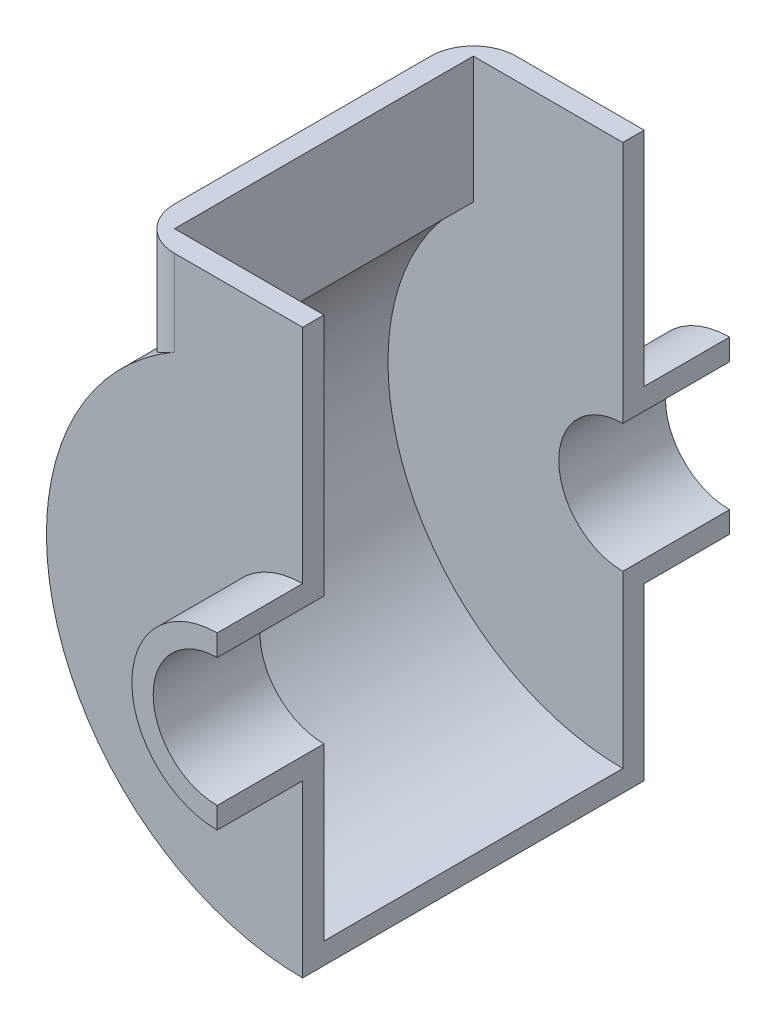
ISO-10303-21;
HEADER;
FILE_DESCRIPTION(('STEP AP214'),'2;1');
FILE_NAME('part.step','',(''),(''),'','','');
FILE_SCHEMA(('AUTOMOTIVE_DESIGN { 1 0 10303 214 1 1 1 1 }'));
ENDSEC;
DATA;
#1=APPLICATION_CONTEXT('core data for automotive mechanical design processes');
#2=APPLICATION_PROTOCOL_DEFINITION('international standard','automotive_design',2000,#1);
#3=PRODUCT_CONTEXT('',#1,'mechanical');
#4=PRODUCT('Part','Part','',(#3));
#5=PRODUCT_RELATED_PRODUCT_CATEGORY('part','',(#4));
#6=PRODUCT_DEFINITION_FORMATION('','',#4);
#7=PRODUCT_DEFINITION_CONTEXT('part definition',#1,'design');
#8=PRODUCT_DEFINITION('design','',#6,#7);
#9=PRODUCT_DEFINITION_SHAPE('','',#8);
#10=(LENGTH_UNIT() NAMED_UNIT(*) SI_UNIT(.MILLI.,.METRE.));
#11=(NAMED_UNIT(*) PLANE_ANGLE_UNIT() SI_UNIT($,.RADIAN.));
#12=(NAMED_UNIT(*) SI_UNIT($,.STERADIAN.) SOLID_ANGLE_UNIT());
#13=UNCERTAINTY_MEASURE_WITH_UNIT(LENGTH_MEASURE(1.E-05),#10,'distance_accuracy_value','');
#14=(GEOMETRIC_REPRESENTATION_CONTEXT(3) GLOBAL_UNCERTAINTY_ASSIGNED_CONTEXT((#13)) GLOBAL_UNIT_ASSIGNED_CONTEXT((#10,
#11,#12)) REPRESENTATION_CONTEXT('',''));
#15=CARTESIAN_POINT('',(0.,0.,0.));
#16=DIRECTION('',(0.,0.,1.));
#17=DIRECTION('',(1.,0.,0.));
#18=AXIS2_PLACEMENT_3D('',#15,#16,#17);
#19=CARTESIAN_POINT('',(0.,0.,0.));
#20=DIRECTION('',(0.,0.,1.));
#21=DIRECTION('',(1.,0.,0.));
#22=AXIS2_PLACEMENT_3D('',#19,#20,#21);
#23=PLANE('',#22);
#24=CARTESIAN_POINT('',(0.,0.,0.));
#25=DIRECTION('',(0.,0.,1.));
#26=DIRECTION('',(1.,0.,0.));
#27=AXIS2_PLACEMENT_3D('',#24,#25,#26);
#28=CIRCLE('',#27,55.);
#29=CARTESIAN_POINT('',(-35.,42.4264068711928,0.));
#30=VERTEX_POINT('',#29);
#31=CARTESIAN_POINT('',(0.,-55.,0.));
#32=VERTEX_POINT('',#31);
#33=EDGE_CURVE('E227',#30,#32,#28,.T.);
#34=ORIENTED_EDGE('',*,*,#33,.F.);
#35=DIRECTION('',(0.,1.,0.));
#36=VECTOR('',#35,1.);
#37=CARTESIAN_POINT('',(-35.,72.,0.));
#38=LINE('',#37,#36);
#39=CARTESIAN_POINT('',(-35.,72.,0.));
#40=VERTEX_POINT('',#39);
#41=EDGE_CURVE('E231',#40,#30,#38,.F.);
#42=ORIENTED_EDGE('',*,*,#41,.F.);
#43=DIRECTION('',(-1.,0.,0.));
#44=VECTOR('',#43,1.);
#45=CARTESIAN_POINT('',(-40.,72.,0.));
#46=LINE('',#45,#44);
#47=CARTESIAN_POINT('',(0.,72.,0.));
#48=VERTEX_POINT('',#47);
#49=EDGE_CURVE('E230',#48,#40,#46,.T.);
#50=ORIENTED_EDGE('',*,*,#49,.F.);
#51=DIRECTION('',(0.,1.,0.));
#52=VECTOR('',#51,1.);
#53=CARTESIAN_POINT('',(0.,15.,0.));
#54=LINE('',#53,#52);
#55=CARTESIAN_POINT('',(0.,15.,0.));
#56=VERTEX_POINT('',#55);
#57=EDGE_CURVE('E287',#56,#48,#54,.T.);
#58=ORIENTED_EDGE('',*,*,#57,.F.);
#59=CARTESIAN_POINT('',(0.,0.,0.));
#60=DIRECTION('',(0.,0.,-1.));
#61=DIRECTION('',(1.,0.,0.));
#62=AXIS2_PLACEMENT_3D('',#59,#60,#61);
#63=CIRCLE('',#62,15.);
#64=CARTESIAN_POINT('',(0.,-15.,0.));
#65=VERTEX_POINT('',#64);
#66=EDGE_CURVE('E273',#65,#56,#63,.T.);
#67=ORIENTED_EDGE('',*,*,#66,.F.);
#68=DIRECTION('',(0.,1.,0.));
#69=VECTOR('',#68,1.);
#70=CARTESIAN_POINT('',(0.,-15.,0.));
#71=LINE('',#70,#69);
#72=EDGE_CURVE('E278',#32,#65,#71,.T.);
#73=ORIENTED_EDGE('',*,*,#72,.F.);
#74=EDGE_LOOP('',(#34,#42,#50,#58,#67,#73));
#75=FACE_BOUND('',#74,.T.);
#76=ADVANCED_FACE('F39',(#75),#23,.F.);
#77=CARTESIAN_POINT('',(0.,0.,25.));
#78=DIRECTION('',(0.,0.,-1.));
#79=DIRECTION('',(-1.,0.,0.));
#80=AXIS2_PLACEMENT_3D('',#77,#78,#79);
#81=CYLINDRICAL_SURFACE('',#80,15.);
#82=DIRECTION('',(0.,0.,-1.));
#83=VECTOR('',#82,1.);
#84=CARTESIAN_POINT('',(0.,-15.,25.));
#85=LINE('',#84,#83);
#86=CARTESIAN_POINT('',(0.,-15.,25.));
#87=VERTEX_POINT('',#86);
#88=EDGE_CURVE('E284',#87,#65,#85,.T.);
#89=ORIENTED_EDGE('',*,*,#88,.T.);
#90=ORIENTED_EDGE('',*,*,#66,.T.);
#91=DIRECTION('',(0.,0.,-1.));
#92=VECTOR('',#91,1.);
#93=CARTESIAN_POINT('',(0.,15.,25.));
#94=LINE('',#93,#92);
#95=CARTESIAN_POINT('',(0.,15.,25.));
#96=VERTEX_POINT('',#95);
#97=EDGE_CURVE('E297',#96,#56,#94,.T.);
#98=ORIENTED_EDGE('',*,*,#97,.F.);
#99=CARTESIAN_POINT('',(0.,0.,25.));
#100=DIRECTION('',(0.,0.,-1.));
#101=DIRECTION('',(1.,0.,0.));
#102=AXIS2_PLACEMENT_3D('',#99,#100,#101);
#103=CIRCLE('',#102,15.);
#104=EDGE_CURVE('E274',#87,#96,#103,.T.);
#105=ORIENTED_EDGE('',*,*,#104,.F.);
#106=EDGE_LOOP('',(#89,#90,#98,#105));
#107=FACE_BOUND('',#106,.T.);
#108=ADVANCED_FACE('F323',(#107),#81,.F.);
#109=CARTESIAN_POINT('',(0.,15.,25.));
#110=DIRECTION('',(-1.,0.,0.));
#111=DIRECTION('',(0.,-1.,0.));
#112=AXIS2_PLACEMENT_3D('',#109,#110,#111);
#113=PLANE('',#112);
#114=ORIENTED_EDGE('',*,*,#97,.T.);
#115=ORIENTED_EDGE('',*,*,#57,.T.);
#116=DIRECTION('',(0.,0.,-1.));
#117=VECTOR('',#116,1.);
#118=CARTESIAN_POINT('',(0.,72.,5.));
#119=LINE('',#118,#117);
#120=CARTESIAN_POINT('',(0.,72.,5.));
#121=VERTEX_POINT('',#120);
#122=EDGE_CURVE('E268',#121,#48,#119,.T.);
#123=ORIENTED_EDGE('',*,*,#122,.F.);
#124=DIRECTION('',(0.,1.,0.));
#125=VECTOR('',#124,1.);
#126=CARTESIAN_POINT('',(0.,15.,5.));
#127=LINE('',#126,#125);
#128=CARTESIAN_POINT('',(0.,20.,5.));
#129=VERTEX_POINT('',#128);
#130=EDGE_CURVE('E248',#129,#121,#127,.T.);
#131=ORIENTED_EDGE('',*,*,#130,.F.);
#132=DIRECTION('',(0.,0.,-1.));
#133=VECTOR('',#132,1.);
#134=CARTESIAN_POINT('',(0.,20.,25.));
#135=LINE('',#134,#133);
#136=CARTESIAN_POINT('',(0.,20.,25.));
#137=VERTEX_POINT('',#136);
#138=EDGE_CURVE('E295',#137,#129,#135,.T.);
#139=ORIENTED_EDGE('',*,*,#138,.F.);
#140=DIRECTION('',(0.,1.,0.));
#141=VECTOR('',#140,1.);
#142=CARTESIAN_POINT('',(0.,15.,25.));
#143=LINE('',#142,#141);
#144=EDGE_CURVE('E277',#96,#137,#143,.T.);
#145=ORIENTED_EDGE('',*,*,#144,.F.);
#146=EDGE_LOOP('',(#114,#115,#123,#131,#139,#145));
#147=FACE_BOUND('',#146,.T.);
#148=ADVANCED_FACE('F326',(#147),#113,.F.);
#149=CARTESIAN_POINT('',(0.,0.,25.));
#150=DIRECTION('',(0.,0.,-1.));
#151=DIRECTION('',(-1.,0.,0.));
#152=AXIS2_PLACEMENT_3D('',#149,#150,#151);
#153=CYLINDRICAL_SURFACE('',#152,20.);
#154=ORIENTED_EDGE('',*,*,#138,.T.);
#155=CARTESIAN_POINT('',(0.,0.,5.));
#156=DIRECTION('',(0.,0.,1.));
#157=DIRECTION('',(1.,0.,0.));
#158=AXIS2_PLACEMENT_3D('',#155,#156,#157);
#159=CIRCLE('',#158,20.);
#160=CARTESIAN_POINT('',(0.,-20.,5.));
#161=VERTEX_POINT('',#160);
#162=EDGE_CURVE('E271',#129,#161,#159,.T.);
#163=ORIENTED_EDGE('',*,*,#162,.T.);
#164=DIRECTION('',(0.,0.,-1.));
#165=VECTOR('',#164,1.);
#166=CARTESIAN_POINT('',(0.,-20.,25.));
#167=LINE('',#166,#165);
#168=CARTESIAN_POINT('',(0.,-20.,25.));
#169=VERTEX_POINT('',#168);
#170=EDGE_CURVE('E292',#169,#161,#167,.T.);
#171=ORIENTED_EDGE('',*,*,#170,.F.);
#172=CARTESIAN_POINT('',(0.,0.,25.));
#173=DIRECTION('',(0.,0.,1.));
#174=DIRECTION('',(1.,0.,0.));
#175=AXIS2_PLACEMENT_3D('',#172,#173,#174);
#176=CIRCLE('',#175,20.);
#177=EDGE_CURVE('E280',#137,#169,#176,.T.);
#178=ORIENTED_EDGE('',*,*,#177,.F.);
#179=EDGE_LOOP('',(#154,#163,#171,#178));
#180=FACE_BOUND('',#179,.T.);
#181=ADVANCED_FACE('F330',(#180),#153,.T.);
#182=CARTESIAN_POINT('',(0.,-15.,25.));
#183=DIRECTION('',(-1.,0.,0.));
#184=DIRECTION('',(0.,-1.,0.));
#185=AXIS2_PLACEMENT_3D('',#182,#183,#184);
#186=PLANE('',#185);
#187=ORIENTED_EDGE('',*,*,#170,.T.);
#188=DIRECTION('',(0.,1.,0.));
#189=VECTOR('',#188,1.);
#190=CARTESIAN_POINT('',(0.,-20.,5.));
#191=LINE('',#190,#189);
#192=CARTESIAN_POINT('',(0.,-60.,5.));
#193=VERTEX_POINT('',#192);
#194=EDGE_CURVE('E255',#193,#161,#191,.T.);
#195=ORIENTED_EDGE('',*,*,#194,.F.);
#196=DIRECTION('',(0.,0.,-1.));
#197=VECTOR('',#196,1.);
#198=CARTESIAN_POINT('',(0.,-60.,5.));
#199=LINE('',#198,#197);
#200=CARTESIAN_POINT('',(0.,-60.,-75.));
#201=VERTEX_POINT('',#200);
#202=EDGE_CURVE('E258',#193,#201,#199,.T.);
#203=ORIENTED_EDGE('',*,*,#202,.T.);
#204=DIRECTION('',(0.,1.,0.));
#205=VECTOR('',#204,1.);
#206=CARTESIAN_POINT('',(0.,-20.,-75.));
#207=LINE('',#206,#205);
#208=CARTESIAN_POINT('',(0.,-20.,-75.));
#209=VERTEX_POINT('',#208);
#210=EDGE_CURVE('E186',#201,#209,#207,.T.);
#211=ORIENTED_EDGE('',*,*,#210,.T.);
#212=DIRECTION('',(0.,0.,1.));
#213=VECTOR('',#212,1.);
#214=CARTESIAN_POINT('',(0.,-20.,-95.));
#215=LINE('',#214,#213);
#216=CARTESIAN_POINT('',(0.,-20.,-95.));
#217=VERTEX_POINT('',#216);
#218=EDGE_CURVE('E219',#217,#209,#215,.T.);
#219=ORIENTED_EDGE('',*,*,#218,.F.);
#220=DIRECTION('',(0.,1.,0.));
#221=VECTOR('',#220,1.);
#222=CARTESIAN_POINT('',(0.,-15.,-95.));
#223=LINE('',#222,#221);
#224=CARTESIAN_POINT('',(0.,-15.,-95.));
#225=VERTEX_POINT('',#224);
#226=EDGE_CURVE('E209',#217,#225,#223,.T.);
#227=ORIENTED_EDGE('',*,*,#226,.T.);
#228=DIRECTION('',(0.,0.,1.));
#229=VECTOR('',#228,1.);
#230=CARTESIAN_POINT('',(0.,-15.,-95.));
#231=LINE('',#230,#229);
#232=CARTESIAN_POINT('',(0.,-15.,-70.));
#233=VERTEX_POINT('',#232);
#234=EDGE_CURVE('E211',#225,#233,#231,.T.);
#235=ORIENTED_EDGE('',*,*,#234,.T.);
#236=DIRECTION('',(0.,1.,0.));
#237=VECTOR('',#236,1.);
#238=CARTESIAN_POINT('',(0.,-15.,-70.));
#239=LINE('',#238,#237);
#240=CARTESIAN_POINT('',(0.,-55.,-70.));
#241=VERTEX_POINT('',#240);
#242=EDGE_CURVE('E204',#241,#233,#239,.T.);
#243=ORIENTED_EDGE('',*,*,#242,.F.);
#244=DIRECTION('',(0.,0.,1.));
#245=VECTOR('',#244,1.);
#246=CARTESIAN_POINT('',(0.,-55.,-95.002));
#247=LINE('',#246,#245);
#248=EDGE_CURVE('E235',#241,#32,#247,.T.);
#249=ORIENTED_EDGE('',*,*,#248,.T.);
#250=ORIENTED_EDGE('',*,*,#72,.T.);
#251=ORIENTED_EDGE('',*,*,#88,.F.);
#252=DIRECTION('',(0.,1.,0.));
#253=VECTOR('',#252,1.);
#254=CARTESIAN_POINT('',(0.,-15.,25.));
#255=LINE('',#254,#253);
#256=EDGE_CURVE('E282',#169,#87,#255,.T.);
#257=ORIENTED_EDGE('',*,*,#256,.F.);
#258=EDGE_LOOP('',(#187,#195,#203,#211,#219,#227,#235,#243,#249,#250,#251,#257));
#259=FACE_BOUND('',#258,.T.);
#260=ADVANCED_FACE('F334',(#259),#186,.F.);
#261=CARTESIAN_POINT('',(0.,0.,25.));
#262=DIRECTION('',(0.,0.,1.));
#263=DIRECTION('',(1.,0.,0.));
#264=AXIS2_PLACEMENT_3D('',#261,#262,#263);
#265=PLANE('',#264);
#266=ORIENTED_EDGE('',*,*,#104,.T.);
#267=ORIENTED_EDGE('',*,*,#144,.T.);
#268=ORIENTED_EDGE('',*,*,#177,.T.);
#269=ORIENTED_EDGE('',*,*,#256,.T.);
#270=EDGE_LOOP('',(#266,#267,#268,#269));
#271=FACE_BOUND('',#270,.T.);
#272=ADVANCED_FACE('F338',(#271),#265,.T.);
#273=CARTESIAN_POINT('',(0.,0.,5.));
#274=DIRECTION('',(0.,0.,1.));
#275=DIRECTION('',(1.,0.,0.));
#276=AXIS2_PLACEMENT_3D('',#273,#274,#275);
#277=PLANE('',#276);
#278=DIRECTION('',(-1.,0.,0.));
#279=VECTOR('',#278,1.);
#280=CARTESIAN_POINT('',(-40.,72.,5.));
#281=LINE('',#280,#279);
#282=CARTESIAN_POINT('',(-30.,72.,5.));
#283=VERTEX_POINT('',#282);
#284=EDGE_CURVE('E250',#121,#283,#281,.T.);
#285=ORIENTED_EDGE('',*,*,#284,.T.);
#286=DIRECTION('',(0.,-1.,0.));
#287=VECTOR('',#286,1.);
#288=CARTESIAN_POINT('',(-30.,44.7213595499958,5.));
#289=LINE('',#288,#287);
#290=CARTESIAN_POINT('',(-30.,51.9615242270663,5.));
#291=VERTEX_POINT('',#290);
#292=EDGE_CURVE('E299',#283,#291,#289,.T.);
#293=ORIENTED_EDGE('',*,*,#292,.T.);
#294=CARTESIAN_POINT('',(0.,0.,5.));
#295=DIRECTION('',(0.,0.,1.));
#296=DIRECTION('',(1.,0.,0.));
#297=AXIS2_PLACEMENT_3D('',#294,#295,#296);
#298=CIRCLE('',#297,60.);
#299=EDGE_CURVE('E253',#291,#193,#298,.T.);
#300=ORIENTED_EDGE('',*,*,#299,.T.);
#301=ORIENTED_EDGE('',*,*,#194,.T.);
#302=ORIENTED_EDGE('',*,*,#162,.F.);
#303=ORIENTED_EDGE('',*,*,#130,.T.);
#304=EDGE_LOOP('',(#285,#293,#300,#301,#302,#303));
#305=FACE_BOUND('',#304,.T.);
#306=ADVANCED_FACE('F345',(#305),#277,.T.);
#307=CARTESIAN_POINT('',(-40.,72.,5.));
#308=DIRECTION('',(0.,-1.,0.));
#309=DIRECTION('',(0.,0.,-1.));
#310=AXIS2_PLACEMENT_3D('',#307,#308,#309);
#311=PLANE('',#310);
#312=DIRECTION('',(-1.,0.,0.));
#313=VECTOR('',#312,1.);
#314=CARTESIAN_POINT('',(-40.,72.,-75.));
#315=LINE('',#314,#313);
#316=CARTESIAN_POINT('',(0.,72.,-75.));
#317=VERTEX_POINT('',#316);
#318=CARTESIAN_POINT('',(-30.,72.,-75.));
#319=VERTEX_POINT('',#318);
#320=EDGE_CURVE('E167',#317,#319,#315,.T.);
#321=ORIENTED_EDGE('',*,*,#320,.T.);
#322=CARTESIAN_POINT('',(-30.,72.,-65.));
#323=DIRECTION('',(0.,-1.,0.));
#324=DIRECTION('',(0.,0.,-1.));
#325=AXIS2_PLACEMENT_3D('',#322,#323,#324);
#326=CIRCLE('',#325,10.);
#327=CARTESIAN_POINT('',(-40.,72.,-65.));
#328=VERTEX_POINT('',#327);
#329=EDGE_CURVE('E53',#319,#328,#326,.F.);
#330=ORIENTED_EDGE('',*,*,#329,.T.);
#331=DIRECTION('',(0.,0.,-1.));
#332=VECTOR('',#331,1.);
#333=CARTESIAN_POINT('',(-40.,72.,5.));
#334=LINE('',#333,#332);
#335=CARTESIAN_POINT('',(-40.,72.,-5.));
#336=VERTEX_POINT('',#335);
#337=EDGE_CURVE('E265',#336,#328,#334,.T.);
#338=ORIENTED_EDGE('',*,*,#337,.F.);
#339=CARTESIAN_POINT('',(-30.,72.,-5.));
#340=DIRECTION('',(0.,-1.,0.));
#341=DIRECTION('',(0.,0.,-1.));
#342=AXIS2_PLACEMENT_3D('',#339,#340,#341);
#343=CIRCLE('',#342,10.);
#344=EDGE_CURVE('E304',#336,#283,#343,.F.);
#345=ORIENTED_EDGE('',*,*,#344,.T.);
#346=ORIENTED_EDGE('',*,*,#284,.F.);
#347=ORIENTED_EDGE('',*,*,#122,.T.);
#348=ORIENTED_EDGE('',*,*,#49,.T.);
#349=DIRECTION('',(0.,0.,1.));
#350=VECTOR('',#349,1.);
#351=CARTESIAN_POINT('',(-35.,72.,-95.002));
#352=LINE('',#351,#350);
#353=CARTESIAN_POINT('',(-35.,72.,-70.));
#354=VERTEX_POINT('',#353);
#355=EDGE_CURVE('E234',#354,#40,#352,.T.);
#356=ORIENTED_EDGE('',*,*,#355,.F.);
#357=DIRECTION('',(-1.,0.,0.));
#358=VECTOR('',#357,1.);
#359=CARTESIAN_POINT('',(-40.,72.,-70.));
#360=LINE('',#359,#358);
#361=CARTESIAN_POINT('',(0.,72.,-70.));
#362=VERTEX_POINT('',#361);
#363=EDGE_CURVE('E182',#362,#354,#360,.T.);
#364=ORIENTED_EDGE('',*,*,#363,.F.);
#365=DIRECTION('',(0.,0.,1.));
#366=VECTOR('',#365,1.);
#367=CARTESIAN_POINT('',(0.,72.,-75.));
#368=LINE('',#367,#366);
#369=EDGE_CURVE('E178',#317,#362,#368,.T.);
#370=ORIENTED_EDGE('',*,*,#369,.F.);
#371=EDGE_LOOP('',(#321,#330,#338,#345,#346,#347,#348,#356,#364,#370));
#372=FACE_BOUND('',#371,.T.);
#373=ADVANCED_FACE('F179',(#372),#311,.F.);
#374=CARTESIAN_POINT('',(-40.,44.7213595499958,5.));
#375=DIRECTION('',(1.,0.,0.));
#376=DIRECTION('',(0.,0.,-1.));
#377=AXIS2_PLACEMENT_3D('',#374,#375,#376);
#378=PLANE('',#377);
#379=ORIENTED_EDGE('',*,*,#337,.T.);
#380=DIRECTION('',(0.,-1.,0.));
#381=VECTOR('',#380,1.);
#382=CARTESIAN_POINT('',(-40.,44.7213595499958,-65.));
#383=LINE('',#382,#381);
#384=CARTESIAN_POINT('',(-40.,44.7213595499958,-65.));
#385=VERTEX_POINT('',#384);
#386=EDGE_CURVE('E312',#328,#385,#383,.T.);
#387=ORIENTED_EDGE('',*,*,#386,.T.);
#388=DIRECTION('',(0.,0.,-1.));
#389=VECTOR('',#388,1.);
#390=CARTESIAN_POINT('',(-40.,44.7213595499958,5.));
#391=LINE('',#390,#389);
#392=CARTESIAN_POINT('',(-40.,44.7213595499958,-5.));
#393=VERTEX_POINT('',#392);
#394=EDGE_CURVE('E262',#393,#385,#391,.T.);
#395=ORIENTED_EDGE('',*,*,#394,.F.);
#396=DIRECTION('',(0.,-1.,0.));
#397=VECTOR('',#396,1.);
#398=CARTESIAN_POINT('',(-40.,72.,-5.));
#399=LINE('',#398,#397);
#400=EDGE_CURVE('E302',#393,#336,#399,.F.);
#401=ORIENTED_EDGE('',*,*,#400,.T.);
#402=EDGE_LOOP('',(#379,#387,#395,#401));
#403=FACE_BOUND('',#402,.T.);
#404=ADVANCED_FACE('F348',(#403),#378,.F.);
#405=CARTESIAN_POINT('',(0.,0.,5.));
#406=DIRECTION('',(0.,0.,-1.));
#407=DIRECTION('',(-1.,0.,0.));
#408=AXIS2_PLACEMENT_3D('',#405,#406,#407);
#409=CYLINDRICAL_SURFACE('',#408,60.);
#410=ORIENTED_EDGE('',*,*,#299,.F.);
#411=CARTESIAN_POINT('',(-30.,51.9615242270663,5.));
#412=CARTESIAN_POINT('',(-30.1846403402756,51.8549243575684,4.99999694467445));
#413=CARTESIAN_POINT('',(-30.3686755821332,51.7473565843307,4.99488587812623));
#414=CARTESIAN_POINT('',(-30.7351668388072,51.5305231450817,4.97462918627216));
#415=CARTESIAN_POINT('',(-30.9176229894396,51.4212576273974,4.95948443281986));
#416=CARTESIAN_POINT('',(-31.4619253243051,51.0913595980358,4.89929167200636));
#417=CARTESIAN_POINT('',(-31.8209014856786,50.868512343648,4.83948477245505));
#418=CARTESIAN_POINT('',(-32.5288887310146,50.418725257113,4.68176841927459));
#419=CARTESIAN_POINT('',(-32.8778736192083,50.1917768316845,4.5837671788936));
#420=CARTESIAN_POINT('',(-33.562476910193,49.7365966241752,4.35090696893926));
#421=CARTESIAN_POINT('',(-33.8980954977704,49.5083648598862,4.21604850911225));
#422=CARTESIAN_POINT('',(-34.5207296024579,49.0759439346811,3.92574534472068));
#423=CARTESIAN_POINT('',(-34.8092512536601,48.8716304811259,3.77370267176126));
#424=CARTESIAN_POINT('',(-35.3716903107987,48.4661085573826,3.44107089228342));
#425=CARTESIAN_POINT('',(-35.6456079007732,48.2649000480893,3.26048214561176));
#426=CARTESIAN_POINT('',(-36.1765727574088,47.8682074936152,2.87135112309205));
#427=CARTESIAN_POINT('',(-36.4336405194033,47.6727166603459,2.66284378257167));
#428=CARTESIAN_POINT('',(-36.9290721152615,47.289972828363,2.21794621899144));
#429=CARTESIAN_POINT('',(-37.167441451851,47.1027174132443,1.98156425075618));
#430=CARTESIAN_POINT('',(-37.565018182153,46.785859634165,1.54478146403292));
#431=CARTESIAN_POINT('',(-37.7289458526818,46.6537017113221,1.35050833176437));
#432=CARTESIAN_POINT('',(-38.0437650386959,46.397339573439,0.946710505836691));
#433=CARTESIAN_POINT('',(-38.1946575996422,46.2731347207424,0.737187037795451));
#434=CARTESIAN_POINT('',(-38.4818360085844,46.0345861261904,0.303399948510743));
#435=CARTESIAN_POINT('',(-38.618136880254,45.9202322658759,0.0791518792914404));
#436=CARTESIAN_POINT('',(-38.8746918035924,45.7032445431668,-0.383743447816962));
#437=CARTESIAN_POINT('',(-38.9949492411763,45.6006082084878,-0.62238765196006));
#438=CARTESIAN_POINT('',(-39.1965662504922,45.4273417305266,-1.06669402634214));
#439=CARTESIAN_POINT('',(-39.2809795718102,45.3543309967536,-1.27004581930021));
#440=CARTESIAN_POINT('',(-39.437114382813,45.2186323209963,-1.68488791321454));
#441=CARTESIAN_POINT('',(-39.508838494378,45.1559422467147,-1.89637652189831));
#442=CARTESIAN_POINT('',(-39.6385128100447,45.0421551914612,-2.32617263610176));
#443=CARTESIAN_POINT('',(-39.6964869139818,44.9910381018204,-2.54446755239788));
#444=CARTESIAN_POINT('',(-39.7978943535571,44.9013606141582,-2.98685266600599));
#445=CARTESIAN_POINT('',(-39.8413328734582,44.8627957393971,-3.21094076633609));
#446=CARTESIAN_POINT('',(-39.9177189665931,44.7948514731765,-3.6937744282411));
#447=CARTESIAN_POINT('',(-39.9484884415043,44.7673886419263,-3.95314914513774));
#448=CARTESIAN_POINT('',(-39.9793476433001,44.7398248250479,-4.34440444684136));
#449=CARTESIAN_POINT('',(-39.987084921451,44.7329085695169,-4.47527578752073));
#450=CARTESIAN_POINT('',(-39.9974129661721,44.7236736235071,-4.73742237599204));
#451=CARTESIAN_POINT('',(-40.0000021863485,44.7213563144782,-4.86869773328782));
#452=CARTESIAN_POINT('',(-40.,44.7213595499958,-5.));
#453=B_SPLINE_CURVE_WITH_KNOTS('',3,(#411,#412,#413,#414,#415,#416,#417,#418,#419,#420,#421,
#422,#423,#424,#425,#426,#427,#428,#429,#430,#431,#432,#433,#434,#435,#436,#437,#438,#439,#440,
#441,#442,#443,#444,#445,#446,#447,#448,#449,#450,#451,#452),.UNSPECIFIED.,.F.,.F.,(4,2,2,2,2,2,
2,2,2,2,2,2,2,2,2,2,2,2,2,2,4),(0.,0.639469988122809,1.27888441829631,2.5570367234409,
3.83827975129429,5.11950506007103,6.27274736359202,7.42597513070352,8.5777730871098,
9.72923080131073,10.5879927572485,11.4466857734357,12.3044859953459,13.1621048939207,
13.8573439066469,14.5524390989254,15.2463170957639,15.9399473495783,16.7262834977137,
17.1199731890566,17.5137811205932),.UNSPECIFIED.);
#454=EDGE_CURVE('E306',#291,#393,#453,.T.);
#455=ORIENTED_EDGE('',*,*,#454,.T.);
#456=ORIENTED_EDGE('',*,*,#394,.T.);
#457=CARTESIAN_POINT('',(-40.,44.7213595499958,-65.));
#458=CARTESIAN_POINT('',(-40.0000015812733,44.7213573011344,-65.1176634010021));
#459=CARTESIAN_POINT('',(-39.9979227141808,44.7232176305845,-65.2353086549857));
#460=CARTESIAN_POINT('',(-39.9896253110866,44.7306372942271,-65.4703286016599));
#461=CARTESIAN_POINT('',(-39.9834070494192,44.7361963832882,-65.5877033117632));
#462=CARTESIAN_POINT('',(-39.9585923280535,44.7583670958171,-65.9388427467586));
#463=CARTESIAN_POINT('',(-39.9338358355778,44.7804722797486,-66.1718758054602));
#464=CARTESIAN_POINT('',(-39.8686644525486,44.8385042167555,-66.6318691326489));
#465=CARTESIAN_POINT('',(-39.8283855148164,44.8743109465834,-66.8588643223737));
#466=CARTESIAN_POINT('',(-39.7328892662281,44.9588875680342,-67.3072524479117));
#467=CARTESIAN_POINT('',(-39.6776696039361,45.0076595001554,-67.5286444958756));
#468=CARTESIAN_POINT('',(-39.5534118644793,45.1168972505339,-67.9636688649734));
#469=CARTESIAN_POINT('',(-39.4844211995899,45.1773229225701,-68.1773249178853));
#470=CARTESIAN_POINT('',(-39.3334605195833,45.3088170177995,-68.5966936542645));
#471=CARTESIAN_POINT('',(-39.2514857085459,45.3798893730022,-68.8024033675523));
#472=CARTESIAN_POINT('',(-39.0753863002099,45.5316122169457,-69.2054529377369));
#473=CARTESIAN_POINT('',(-38.9812363061758,45.6122826978885,-69.4027741200324));
#474=CARTESIAN_POINT('',(-38.7818943790383,45.7818938454653,-69.788046749896));
#475=CARTESIAN_POINT('',(-38.6767013504078,45.8708353325264,-69.9759972651116));
#476=CARTESIAN_POINT('',(-38.4135728743112,46.0916172160901,-70.4129070483267));
#477=CARTESIAN_POINT('',(-38.2509572804995,46.2267600621542,-70.6573967975822));
#478=CARTESIAN_POINT('',(-37.908447036405,46.5080507377658,-71.1270697633622));
#479=CARTESIAN_POINT('',(-37.7285517130429,46.6541989959475,-71.3522522271834));
#480=CARTESIAN_POINT('',(-37.3531054007839,46.9553345195759,-71.783333742699));
#481=CARTESIAN_POINT('',(-37.1575367002328,47.1103317262239,-71.9892103913973));
#482=CARTESIAN_POINT('',(-36.7525951751676,47.4269223387039,-72.3811838692743));
#483=CARTESIAN_POINT('',(-36.5432234671629,47.5885152106185,-72.5672822951176));
#484=CARTESIAN_POINT('',(-35.889352420626,48.0859277319981,-73.1015951815724));
#485=CARTESIAN_POINT('',(-35.4251261289153,48.429498559668,-73.4189829871174));
#486=CARTESIAN_POINT('',(-34.4553726874119,49.1241578823887,-73.9699716496598));
#487=CARTESIAN_POINT('',(-33.9498747171002,49.4752409388269,-74.2036310842669));
#488=CARTESIAN_POINT('',(-33.1568278633415,50.0073212539565,-74.4930456878643));
#489=CARTESIAN_POINT('',(-32.8810021018505,50.1891501210001,-74.5803819665683));
#490=CARTESIAN_POINT('',(-32.3217375725054,50.5511235483305,-74.7310524671282));
#491=CARTESIAN_POINT('',(-32.0382991780871,50.7312681906542,-74.7943878640466));
#492=CARTESIAN_POINT('',(-31.4650006560554,51.0888227050653,-74.8963939978526));
#493=CARTESIAN_POINT('',(-31.1751356203563,51.2662302982853,-74.935045161166));
#494=CARTESIAN_POINT('',(-30.5906934832528,51.6171131325133,-74.9868485137105));
#495=CARTESIAN_POINT('',(-30.2961152167169,51.7905873747387,-74.9999942965489));
#496=CARTESIAN_POINT('',(-30.,51.9615242270663,-75.));
#497=B_SPLINE_CURVE_WITH_KNOTS('',3,(#457,#458,#459,#460,#461,#462,#463,#464,#465,#466,#467,
#468,#469,#470,#471,#472,#473,#474,#475,#476,#477,#478,#479,#480,#481,#482,#483,#484,#485,#486,
#487,#488,#489,#490,#491,#492,#493,#494,#495,#496),.UNSPECIFIED.,.F.,.F.,(4,2,2,2,2,2,2,2,2,2,2,
2,2,2,2,2,2,2,2,4),(0.,0.352921378883185,0.705819370583158,1.41085932128629,2.10985961734753,
2.80896998914977,3.50571366437716,4.20271529673452,4.90119502233958,5.59974410640154,
6.56805788163332,7.53640938987801,8.50587104319846,9.47525437387456,11.4447404103531,
13.4128458625583,14.4372042618812,15.4615125030147,16.4866319729198,17.5120088970541),.UNSPECIFIED.);
#498=CARTESIAN_POINT('',(-30.,51.9615242270663,-75.));
#499=VERTEX_POINT('',#498);
#500=EDGE_CURVE('E11',#385,#499,#497,.T.);
#501=ORIENTED_EDGE('',*,*,#500,.T.);
#502=CARTESIAN_POINT('',(0.,0.,-75.));
#503=DIRECTION('',(0.,0.,1.));
#504=DIRECTION('',(1.,0.,0.));
#505=AXIS2_PLACEMENT_3D('',#502,#503,#504);
#506=CIRCLE('',#505,60.);
#507=EDGE_CURVE('E60',#499,#201,#506,.T.);
#508=ORIENTED_EDGE('',*,*,#507,.T.);
#509=ORIENTED_EDGE('',*,*,#202,.F.);
#510=EDGE_LOOP('',(#410,#455,#456,#501,#508,#509));
#511=FACE_BOUND('',#510,.T.);
#512=ADVANCED_FACE('F314',(#511),#409,.T.);
#513=CARTESIAN_POINT('',(0.,0.,-95.002));
#514=DIRECTION('',(0.,0.,1.));
#515=DIRECTION('',(1.,0.,0.));
#516=AXIS2_PLACEMENT_3D('',#513,#514,#515);
#517=CYLINDRICAL_SURFACE('',#516,55.);
#518=CARTESIAN_POINT('',(0.,0.,-70.));
#519=DIRECTION('',(0.,0.,-1.));
#520=DIRECTION('',(-1.,0.,0.));
#521=AXIS2_PLACEMENT_3D('',#518,#519,#520);
#522=CIRCLE('',#521,55.);
#523=CARTESIAN_POINT('',(-35.,42.4264068711928,-70.));
#524=VERTEX_POINT('',#523);
#525=EDGE_CURVE('E239',#524,#241,#522,.F.);
#526=ORIENTED_EDGE('',*,*,#525,.F.);
#527=DIRECTION('',(0.,0.,1.));
#528=VECTOR('',#527,1.);
#529=CARTESIAN_POINT('',(-35.,42.4264068711928,-95.002));
#530=LINE('',#529,#528);
#531=EDGE_CURVE('E238',#524,#30,#530,.T.);
#532=ORIENTED_EDGE('',*,*,#531,.T.);
#533=ORIENTED_EDGE('',*,*,#33,.T.);
#534=ORIENTED_EDGE('',*,*,#248,.F.);
#535=EDGE_LOOP('',(#526,#532,#533,#534));
#536=FACE_BOUND('',#535,.T.);
#537=ADVANCED_FACE('F354',(#536),#517,.F.);
#538=CARTESIAN_POINT('',(-35.,72.,-95.002));
#539=DIRECTION('',(-1.,0.,0.));
#540=DIRECTION('',(0.,0.,1.));
#541=AXIS2_PLACEMENT_3D('',#538,#539,#540);
#542=PLANE('',#541);
#543=DIRECTION('',(0.,-1.,0.));
#544=VECTOR('',#543,1.);
#545=CARTESIAN_POINT('',(-35.,72.,-70.));
#546=LINE('',#545,#544);
#547=EDGE_CURVE('E226',#354,#524,#546,.T.);
#548=ORIENTED_EDGE('',*,*,#547,.F.);
#549=ORIENTED_EDGE('',*,*,#355,.T.);
#550=ORIENTED_EDGE('',*,*,#41,.T.);
#551=ORIENTED_EDGE('',*,*,#531,.F.);
#552=EDGE_LOOP('',(#548,#549,#550,#551));
#553=FACE_BOUND('',#552,.T.);
#554=ADVANCED_FACE('F356',(#553),#542,.F.);
#555=CARTESIAN_POINT('',(0.,0.,-70.));
#556=DIRECTION('',(0.,0.,-1.));
#557=DIRECTION('',(1.,0.,0.));
#558=AXIS2_PLACEMENT_3D('',#555,#556,#557);
#559=PLANE('',#558);
#560=ORIENTED_EDGE('',*,*,#547,.T.);
#561=ORIENTED_EDGE('',*,*,#525,.T.);
#562=ORIENTED_EDGE('',*,*,#242,.T.);
#563=CARTESIAN_POINT('',(0.,0.,-70.));
#564=DIRECTION('',(0.,0.,-1.));
#565=DIRECTION('',(1.,0.,0.));
#566=AXIS2_PLACEMENT_3D('',#563,#564,#565);
#567=CIRCLE('',#566,15.);
#568=CARTESIAN_POINT('',(0.,15.,-70.));
#569=VERTEX_POINT('',#568);
#570=EDGE_CURVE('E199',#233,#569,#567,.T.);
#571=ORIENTED_EDGE('',*,*,#570,.T.);
#572=DIRECTION('',(0.,1.,0.));
#573=VECTOR('',#572,1.);
#574=CARTESIAN_POINT('',(0.,15.,-70.));
#575=LINE('',#574,#573);
#576=EDGE_CURVE('E214',#569,#362,#575,.T.);
#577=ORIENTED_EDGE('',*,*,#576,.T.);
#578=ORIENTED_EDGE('',*,*,#363,.T.);
#579=EDGE_LOOP('',(#560,#561,#562,#571,#577,#578));
#580=FACE_BOUND('',#579,.T.);
#581=ADVANCED_FACE('F379',(#580),#559,.F.);
#582=CARTESIAN_POINT('',(0.,0.,-95.));
#583=DIRECTION('',(0.,0.,1.));
#584=DIRECTION('',(-1.,0.,0.));
#585=AXIS2_PLACEMENT_3D('',#582,#583,#584);
#586=CYLINDRICAL_SURFACE('',#585,15.);
#587=ORIENTED_EDGE('',*,*,#234,.F.);
#588=CARTESIAN_POINT('',(0.,0.,-95.));
#589=DIRECTION('',(0.,0.,-1.));
#590=DIRECTION('',(1.,0.,0.));
#591=AXIS2_PLACEMENT_3D('',#588,#589,#590);
#592=CIRCLE('',#591,15.);
#593=CARTESIAN_POINT('',(0.,15.,-95.));
#594=VERTEX_POINT('',#593);
#595=EDGE_CURVE('E200',#225,#594,#592,.T.);
#596=ORIENTED_EDGE('',*,*,#595,.T.);
#597=DIRECTION('',(0.,0.,1.));
#598=VECTOR('',#597,1.);
#599=CARTESIAN_POINT('',(0.,15.,-95.));
#600=LINE('',#599,#598);
#601=EDGE_CURVE('E223',#594,#569,#600,.T.);
#602=ORIENTED_EDGE('',*,*,#601,.T.);
#603=ORIENTED_EDGE('',*,*,#570,.F.);
#604=EDGE_LOOP('',(#587,#596,#602,#603));
#605=FACE_BOUND('',#604,.T.);
#606=ADVANCED_FACE('F384',(#605),#586,.F.);
#607=CARTESIAN_POINT('',(0.,15.,-95.));
#608=DIRECTION('',(-1.,0.,0.));
#609=DIRECTION('',(0.,-1.,0.));
#610=AXIS2_PLACEMENT_3D('',#607,#608,#609);
#611=PLANE('',#610);
#612=ORIENTED_EDGE('',*,*,#601,.F.);
#613=DIRECTION('',(0.,1.,0.));
#614=VECTOR('',#613,1.);
#615=CARTESIAN_POINT('',(0.,15.,-95.));
#616=LINE('',#615,#614);
#617=CARTESIAN_POINT('',(0.,20.,-95.));
#618=VERTEX_POINT('',#617);
#619=EDGE_CURVE('E203',#594,#618,#616,.T.);
#620=ORIENTED_EDGE('',*,*,#619,.T.);
#621=DIRECTION('',(0.,0.,1.));
#622=VECTOR('',#621,1.);
#623=CARTESIAN_POINT('',(0.,20.,-95.));
#624=LINE('',#623,#622);
#625=CARTESIAN_POINT('',(0.,20.,-75.));
#626=VERTEX_POINT('',#625);
#627=EDGE_CURVE('E192',#618,#626,#624,.T.);
#628=ORIENTED_EDGE('',*,*,#627,.T.);
#629=DIRECTION('',(0.,1.,0.));
#630=VECTOR('',#629,1.);
#631=CARTESIAN_POINT('',(0.,15.,-75.));
#632=LINE('',#631,#630);
#633=EDGE_CURVE('E172',#626,#317,#632,.T.);
#634=ORIENTED_EDGE('',*,*,#633,.T.);
#635=ORIENTED_EDGE('',*,*,#369,.T.);
#636=ORIENTED_EDGE('',*,*,#576,.F.);
#637=EDGE_LOOP('',(#612,#620,#628,#634,#635,#636));
#638=FACE_BOUND('',#637,.T.);
#639=ADVANCED_FACE('F189',(#638),#611,.F.);
#640=CARTESIAN_POINT('',(0.,0.,-95.));
#641=DIRECTION('',(0.,0.,1.));
#642=DIRECTION('',(-1.,0.,0.));
#643=AXIS2_PLACEMENT_3D('',#640,#641,#642);
#644=CYLINDRICAL_SURFACE('',#643,20.);
#645=ORIENTED_EDGE('',*,*,#627,.F.);
#646=CARTESIAN_POINT('',(0.,0.,-95.));
#647=DIRECTION('',(0.,0.,1.));
#648=DIRECTION('',(1.,0.,0.));
#649=AXIS2_PLACEMENT_3D('',#646,#647,#648);
#650=CIRCLE('',#649,20.);
#651=EDGE_CURVE('E206',#618,#217,#650,.T.);
#652=ORIENTED_EDGE('',*,*,#651,.T.);
#653=ORIENTED_EDGE('',*,*,#218,.T.);
#654=CARTESIAN_POINT('',(0.,0.,-75.));
#655=DIRECTION('',(0.,0.,1.));
#656=DIRECTION('',(1.,0.,0.));
#657=AXIS2_PLACEMENT_3D('',#654,#655,#656);
#658=CIRCLE('',#657,20.);
#659=EDGE_CURVE('E185',#626,#209,#658,.T.);
#660=ORIENTED_EDGE('',*,*,#659,.F.);
#661=EDGE_LOOP('',(#645,#652,#653,#660));
#662=FACE_BOUND('',#661,.T.);
#663=ADVANCED_FACE('F389',(#662),#644,.T.);
#664=CARTESIAN_POINT('',(0.,0.,-95.));
#665=DIRECTION('',(0.,0.,-1.));
#666=DIRECTION('',(1.,0.,0.));
#667=AXIS2_PLACEMENT_3D('',#664,#665,#666);
#668=PLANE('',#667);
#669=ORIENTED_EDGE('',*,*,#595,.F.);
#670=ORIENTED_EDGE('',*,*,#226,.F.);
#671=ORIENTED_EDGE('',*,*,#651,.F.);
#672=ORIENTED_EDGE('',*,*,#619,.F.);
#673=EDGE_LOOP('',(#669,#670,#671,#672));
#674=FACE_BOUND('',#673,.T.);
#675=ADVANCED_FACE('F386',(#674),#668,.T.);
#676=CARTESIAN_POINT('',(0.,0.,-75.));
#677=DIRECTION('',(0.,0.,-1.));
#678=DIRECTION('',(1.,0.,0.));
#679=AXIS2_PLACEMENT_3D('',#676,#677,#678);
#680=PLANE('',#679);
#681=ORIENTED_EDGE('',*,*,#507,.F.);
#682=DIRECTION('',(0.,-1.,0.));
#683=VECTOR('',#682,1.);
#684=CARTESIAN_POINT('',(-30.,72.,-75.));
#685=LINE('',#684,#683);
#686=EDGE_CURVE('E64',#499,#319,#685,.F.);
#687=ORIENTED_EDGE('',*,*,#686,.T.);
#688=ORIENTED_EDGE('',*,*,#320,.F.);
#689=ORIENTED_EDGE('',*,*,#633,.F.);
#690=ORIENTED_EDGE('',*,*,#659,.T.);
#691=ORIENTED_EDGE('',*,*,#210,.F.);
#692=EDGE_LOOP('',(#681,#687,#688,#689,#690,#691));
#693=FACE_BOUND('',#692,.T.);
#694=ADVANCED_FACE('F169',(#693),#680,.T.);
#695=CARTESIAN_POINT('',(-30.,0.,-5.));
#696=DIRECTION('',(0.,1.,0.));
#697=DIRECTION('',(0.,0.,1.));
#698=AXIS2_PLACEMENT_3D('',#695,#696,#697);
#699=CYLINDRICAL_SURFACE('',#698,10.);
#700=ORIENTED_EDGE('',*,*,#344,.F.);
#701=ORIENTED_EDGE('',*,*,#400,.F.);
#702=ORIENTED_EDGE('',*,*,#454,.F.);
#703=ORIENTED_EDGE('',*,*,#292,.F.);
#704=EDGE_LOOP('',(#700,#701,#702,#703));
#705=FACE_BOUND('',#704,.T.);
#706=ADVANCED_FACE('F318',(#705),#699,.T.);
#707=CARTESIAN_POINT('',(-30.,44.7213595499958,-65.));
#708=DIRECTION('',(0.,1.,0.));
#709=DIRECTION('',(0.,0.,1.));
#710=AXIS2_PLACEMENT_3D('',#707,#708,#709);
#711=CYLINDRICAL_SURFACE('',#710,10.);
#712=ORIENTED_EDGE('',*,*,#329,.F.);
#713=ORIENTED_EDGE('',*,*,#686,.F.);
#714=ORIENTED_EDGE('',*,*,#500,.F.);
#715=ORIENTED_EDGE('',*,*,#386,.F.);
#716=EDGE_LOOP('',(#712,#713,#714,#715));
#717=FACE_BOUND('',#716,.T.);
#718=ADVANCED_FACE('F41',(#717),#711,.T.);
#719=CLOSED_SHELL('',(#76,#108,#148,#181,#260,#272,#306,#373,#404,#512,#537,#554,#581,#606,#639,
#663,#675,#694,#706,#718));
#720=MANIFOLD_SOLID_BREP('B2',#719);
#721=ADVANCED_BREP_SHAPE_REPRESENTATION('',(#18,#720),#14);
#722=SHAPE_DEFINITION_REPRESENTATION(#9,#721);
ENDSEC;
END-ISO-10303-21;
